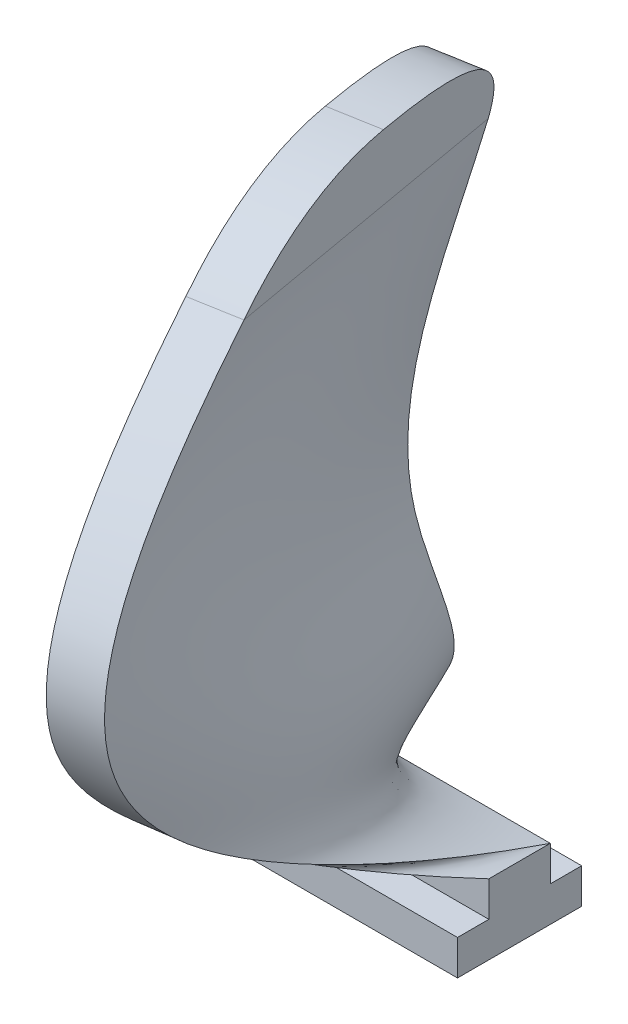
ISO-10303-21;
HEADER;
FILE_DESCRIPTION(('STEP AP214'),'2;1');
FILE_NAME('part.step','',(''),(''),'','','');
FILE_SCHEMA(('AUTOMOTIVE_DESIGN { 1 0 10303 214 1 1 1 1 }'));
ENDSEC;
DATA;
#1=APPLICATION_CONTEXT('core data for automotive mechanical design processes');
#2=APPLICATION_PROTOCOL_DEFINITION('international standard','automotive_design',2000,#1);
#3=PRODUCT_CONTEXT('',#1,'mechanical');
#4=PRODUCT('Part','Part','',(#3));
#5=PRODUCT_RELATED_PRODUCT_CATEGORY('part','',(#4));
#6=PRODUCT_DEFINITION_FORMATION('','',#4);
#7=PRODUCT_DEFINITION_CONTEXT('part definition',#1,'design');
#8=PRODUCT_DEFINITION('design','',#6,#7);
#9=PRODUCT_DEFINITION_SHAPE('','',#8);
#10=(LENGTH_UNIT() NAMED_UNIT(*) SI_UNIT(.MILLI.,.METRE.));
#11=(NAMED_UNIT(*) PLANE_ANGLE_UNIT() SI_UNIT($,.RADIAN.));
#12=(NAMED_UNIT(*) SI_UNIT($,.STERADIAN.) SOLID_ANGLE_UNIT());
#13=UNCERTAINTY_MEASURE_WITH_UNIT(LENGTH_MEASURE(1.E-05),#10,'distance_accuracy_value','');
#14=(GEOMETRIC_REPRESENTATION_CONTEXT(3) GLOBAL_UNCERTAINTY_ASSIGNED_CONTEXT((#13)) GLOBAL_UNIT_ASSIGNED_CONTEXT((#10,
#11,#12)) REPRESENTATION_CONTEXT('',''));
#15=CARTESIAN_POINT('',(0.,0.,0.));
#16=DIRECTION('',(0.,0.,1.));
#17=DIRECTION('',(1.,0.,0.));
#18=AXIS2_PLACEMENT_3D('',#15,#16,#17);
#19=CARTESIAN_POINT('',(10.,2.79856411953538,2.45));
#20=DIRECTION('',(0.,0.,-1.));
#21=DIRECTION('',(0.,1.,0.));
#22=AXIS2_PLACEMENT_3D('',#19,#20,#21);
#23=PLANE('',#22);
#24=DIRECTION('',(0.,-1.,0.));
#25=VECTOR('',#24,1.);
#26=CARTESIAN_POINT('',(-10.,2.79856411953538,2.45));
#27=LINE('',#26,#25);
#28=CARTESIAN_POINT('',(-10.,2.79856411953538,2.45));
#29=VERTEX_POINT('',#28);
#30=CARTESIAN_POINT('',(-10.,0.,2.45));
#31=VERTEX_POINT('',#30);
#32=EDGE_CURVE('E87',#29,#31,#27,.T.);
#33=ORIENTED_EDGE('',*,*,#32,.T.);
#34=DIRECTION('',(-1.,0.,0.));
#35=VECTOR('',#34,1.);
#36=CARTESIAN_POINT('',(10.,0.,2.45));
#37=LINE('',#36,#35);
#38=CARTESIAN_POINT('',(10.,0.,2.45));
#39=VERTEX_POINT('',#38);
#40=EDGE_CURVE('E12',#39,#31,#37,.T.);
#41=ORIENTED_EDGE('',*,*,#40,.F.);
#42=DIRECTION('',(0.,-1.,0.));
#43=VECTOR('',#42,1.);
#44=CARTESIAN_POINT('',(10.,2.79856411953538,2.45));
#45=LINE('',#44,#43);
#46=CARTESIAN_POINT('',(10.,2.79856411953538,2.45));
#47=VERTEX_POINT('',#46);
#48=EDGE_CURVE('E100',#47,#39,#45,.T.);
#49=ORIENTED_EDGE('',*,*,#48,.F.);
#50=DIRECTION('',(1.,0.,0.));
#51=VECTOR('',#50,1.);
#52=CARTESIAN_POINT('',(10.,2.79856411953538,2.45));
#53=LINE('',#52,#51);
#54=EDGE_CURVE('E74',#47,#29,#53,.F.);
#55=ORIENTED_EDGE('',*,*,#54,.T.);
#56=EDGE_LOOP('',(#33,#41,#49,#55));
#57=FACE_BOUND('',#56,.T.);
#58=ADVANCED_FACE('F42',(#57),#23,.F.);
#59=CARTESIAN_POINT('',(10.,2.79856411953538,-2.45));
#60=DIRECTION('',(0.,0.,1.));
#61=DIRECTION('',(0.,-1.,0.));
#62=AXIS2_PLACEMENT_3D('',#59,#60,#61);
#63=PLANE('',#62);
#64=DIRECTION('',(0.,1.,0.));
#65=VECTOR('',#64,1.);
#66=CARTESIAN_POINT('',(-10.,2.79856411953538,-2.45));
#67=LINE('',#66,#65);
#68=CARTESIAN_POINT('',(-10.,0.,-2.45));
#69=VERTEX_POINT('',#68);
#70=CARTESIAN_POINT('',(-10.,2.79856411953538,-2.45));
#71=VERTEX_POINT('',#70);
#72=EDGE_CURVE('E145',#69,#71,#67,.T.);
#73=ORIENTED_EDGE('',*,*,#72,.T.);
#74=DIRECTION('',(1.,0.,0.));
#75=VECTOR('',#74,1.);
#76=CARTESIAN_POINT('',(10.,2.79856411953538,-2.45));
#77=LINE('',#76,#75);
#78=CARTESIAN_POINT('',(10.,2.79856411953538,-2.45));
#79=VERTEX_POINT('',#78);
#80=EDGE_CURVE('E98',#79,#71,#77,.F.);
#81=ORIENTED_EDGE('',*,*,#80,.F.);
#82=DIRECTION('',(0.,1.,0.));
#83=VECTOR('',#82,1.);
#84=CARTESIAN_POINT('',(10.,2.79856411953538,-2.45));
#85=LINE('',#84,#83);
#86=CARTESIAN_POINT('',(10.,0.,-2.45));
#87=VERTEX_POINT('',#86);
#88=EDGE_CURVE('E95',#87,#79,#85,.T.);
#89=ORIENTED_EDGE('',*,*,#88,.F.);
#90=DIRECTION('',(-1.,0.,0.));
#91=VECTOR('',#90,1.);
#92=CARTESIAN_POINT('',(10.,0.,-2.45));
#93=LINE('',#92,#91);
#94=EDGE_CURVE('E52',#87,#69,#93,.T.);
#95=ORIENTED_EDGE('',*,*,#94,.T.);
#96=EDGE_LOOP('',(#73,#81,#89,#95));
#97=FACE_BOUND('',#96,.T.);
#98=ADVANCED_FACE('F96',(#97),#63,.F.);
#99=CARTESIAN_POINT('',(10.,0.,0.));
#100=DIRECTION('',(1.,0.,0.));
#101=DIRECTION('',(0.,0.,-1.));
#102=AXIS2_PLACEMENT_3D('',#99,#100,#101);
#103=PLANE('',#102);
#104=ORIENTED_EDGE('',*,*,#48,.T.);
#105=DIRECTION('',(0.,0.,1.));
#106=VECTOR('',#105,1.);
#107=CARTESIAN_POINT('',(10.,0.,4.95));
#108=LINE('',#107,#106);
#109=CARTESIAN_POINT('',(10.,0.,4.95));
#110=VERTEX_POINT('',#109);
#111=EDGE_CURVE('E118',#39,#110,#108,.T.);
#112=ORIENTED_EDGE('',*,*,#111,.T.);
#113=DIRECTION('',(0.,-1.,0.));
#114=VECTOR('',#113,1.);
#115=CARTESIAN_POINT('',(10.,0.,4.95));
#116=LINE('',#115,#114);
#117=CARTESIAN_POINT('',(10.,-2.8,4.95));
#118=VERTEX_POINT('',#117);
#119=EDGE_CURVE('E136',#110,#118,#116,.T.);
#120=ORIENTED_EDGE('',*,*,#119,.T.);
#121=DIRECTION('',(0.,0.,-1.));
#122=VECTOR('',#121,1.);
#123=CARTESIAN_POINT('',(10.,-2.8,4.95));
#124=LINE('',#123,#122);
#125=CARTESIAN_POINT('',(10.,-2.8,-4.95));
#126=VERTEX_POINT('',#125);
#127=EDGE_CURVE('E441',#118,#126,#124,.T.);
#128=ORIENTED_EDGE('',*,*,#127,.T.);
#129=DIRECTION('',(0.,1.,0.));
#130=VECTOR('',#129,1.);
#131=CARTESIAN_POINT('',(10.,0.,-4.95));
#132=LINE('',#131,#130);
#133=CARTESIAN_POINT('',(10.,0.,-4.95));
#134=VERTEX_POINT('',#133);
#135=EDGE_CURVE('E115',#126,#134,#132,.T.);
#136=ORIENTED_EDGE('',*,*,#135,.T.);
#137=EDGE_CURVE('E107',#134,#87,#108,.T.);
#138=ORIENTED_EDGE('',*,*,#137,.T.);
#139=ORIENTED_EDGE('',*,*,#88,.T.);
#140=DIRECTION('',(0.,0.,-1.));
#141=VECTOR('',#140,1.);
#142=CARTESIAN_POINT('',(10.,2.79856411953538,0.));
#143=LINE('',#142,#141);
#144=EDGE_CURVE('E61',#79,#47,#143,.F.);
#145=ORIENTED_EDGE('',*,*,#144,.T.);
#146=EDGE_LOOP('',(#104,#112,#120,#128,#136,#138,#139,#145));
#147=FACE_BOUND('',#146,.T.);
#148=ADVANCED_FACE('F112',(#147),#103,.T.);
#149=CARTESIAN_POINT('',(-10.,0.,0.));
#150=DIRECTION('',(1.,0.,0.));
#151=DIRECTION('',(0.,0.,-1.));
#152=AXIS2_PLACEMENT_3D('',#149,#150,#151);
#153=PLANE('',#152);
#154=ORIENTED_EDGE('',*,*,#32,.F.);
#155=DIRECTION('',(0.,0.,-1.));
#156=VECTOR('',#155,1.);
#157=CARTESIAN_POINT('',(-10.,2.79856411953538,0.));
#158=LINE('',#157,#156);
#159=EDGE_CURVE('E146',#71,#29,#158,.F.);
#160=ORIENTED_EDGE('',*,*,#159,.F.);
#161=ORIENTED_EDGE('',*,*,#72,.F.);
#162=DIRECTION('',(0.,0.,1.));
#163=VECTOR('',#162,1.);
#164=CARTESIAN_POINT('',(-10.,0.,4.95));
#165=LINE('',#164,#163);
#166=CARTESIAN_POINT('',(-10.,0.,-4.95));
#167=VERTEX_POINT('',#166);
#168=EDGE_CURVE('E109',#167,#69,#165,.T.);
#169=ORIENTED_EDGE('',*,*,#168,.F.);
#170=DIRECTION('',(0.,1.,0.));
#171=VECTOR('',#170,1.);
#172=CARTESIAN_POINT('',(-10.,0.,-4.95));
#173=LINE('',#172,#171);
#174=CARTESIAN_POINT('',(-10.,-2.8,-4.95));
#175=VERTEX_POINT('',#174);
#176=EDGE_CURVE('E132',#175,#167,#173,.T.);
#177=ORIENTED_EDGE('',*,*,#176,.F.);
#178=DIRECTION('',(0.,0.,-1.));
#179=VECTOR('',#178,1.);
#180=CARTESIAN_POINT('',(-10.,-2.8,4.95));
#181=LINE('',#180,#179);
#182=CARTESIAN_POINT('',(-10.,-2.8,4.95));
#183=VERTEX_POINT('',#182);
#184=EDGE_CURVE('E129',#183,#175,#181,.T.);
#185=ORIENTED_EDGE('',*,*,#184,.F.);
#186=DIRECTION('',(0.,-1.,0.));
#187=VECTOR('',#186,1.);
#188=CARTESIAN_POINT('',(-10.,0.,4.95));
#189=LINE('',#188,#187);
#190=CARTESIAN_POINT('',(-10.,0.,4.95));
#191=VERTEX_POINT('',#190);
#192=EDGE_CURVE('E126',#191,#183,#189,.T.);
#193=ORIENTED_EDGE('',*,*,#192,.F.);
#194=EDGE_CURVE('E135',#31,#191,#165,.T.);
#195=ORIENTED_EDGE('',*,*,#194,.F.);
#196=EDGE_LOOP('',(#154,#160,#161,#169,#177,#185,#193,#195));
#197=FACE_BOUND('',#196,.T.);
#198=ADVANCED_FACE('F398',(#197),#153,.F.);
#199=CARTESIAN_POINT('',(10.,0.,4.95));
#200=DIRECTION('',(0.,-1.,0.));
#201=DIRECTION('',(0.,0.,-1.));
#202=AXIS2_PLACEMENT_3D('',#199,#200,#201);
#203=PLANE('',#202);
#204=ORIENTED_EDGE('',*,*,#111,.F.);
#205=ORIENTED_EDGE('',*,*,#40,.T.);
#206=ORIENTED_EDGE('',*,*,#194,.T.);
#207=DIRECTION('',(-1.,0.,0.));
#208=VECTOR('',#207,1.);
#209=CARTESIAN_POINT('',(10.,0.,4.95));
#210=LINE('',#209,#208);
#211=EDGE_CURVE('E117',#110,#191,#210,.T.);
#212=ORIENTED_EDGE('',*,*,#211,.F.);
#213=EDGE_LOOP('',(#204,#205,#206,#212));
#214=FACE_BOUND('',#213,.T.);
#215=ADVANCED_FACE('F390',(#214),#203,.F.);
#216=CARTESIAN_POINT('',(10.,0.,4.95));
#217=DIRECTION('',(0.,0.,-1.));
#218=DIRECTION('',(0.,1.,0.));
#219=AXIS2_PLACEMENT_3D('',#216,#217,#218);
#220=PLANE('',#219);
#221=ORIENTED_EDGE('',*,*,#192,.T.);
#222=DIRECTION('',(-1.,0.,0.));
#223=VECTOR('',#222,1.);
#224=CARTESIAN_POINT('',(10.,-2.8,4.95));
#225=LINE('',#224,#223);
#226=EDGE_CURVE('E142',#118,#183,#225,.T.);
#227=ORIENTED_EDGE('',*,*,#226,.F.);
#228=ORIENTED_EDGE('',*,*,#119,.F.);
#229=ORIENTED_EDGE('',*,*,#211,.T.);
#230=EDGE_LOOP('',(#221,#227,#228,#229));
#231=FACE_BOUND('',#230,.T.);
#232=ADVANCED_FACE('F404',(#231),#220,.F.);
#233=CARTESIAN_POINT('',(10.,-2.8,4.95));
#234=DIRECTION('',(0.,1.,0.));
#235=DIRECTION('',(0.,0.,1.));
#236=AXIS2_PLACEMENT_3D('',#233,#234,#235);
#237=PLANE('',#236);
#238=ORIENTED_EDGE('',*,*,#184,.T.);
#239=DIRECTION('',(-1.,0.,0.));
#240=VECTOR('',#239,1.);
#241=CARTESIAN_POINT('',(10.,-2.8,-4.95));
#242=LINE('',#241,#240);
#243=EDGE_CURVE('E139',#126,#175,#242,.T.);
#244=ORIENTED_EDGE('',*,*,#243,.F.);
#245=ORIENTED_EDGE('',*,*,#127,.F.);
#246=ORIENTED_EDGE('',*,*,#226,.T.);
#247=EDGE_LOOP('',(#238,#244,#245,#246));
#248=FACE_BOUND('',#247,.T.);
#249=ADVANCED_FACE('F407',(#248),#237,.F.);
#250=CARTESIAN_POINT('',(10.,0.,-4.95));
#251=DIRECTION('',(0.,0.,1.));
#252=DIRECTION('',(0.,-1.,0.));
#253=AXIS2_PLACEMENT_3D('',#250,#251,#252);
#254=PLANE('',#253);
#255=ORIENTED_EDGE('',*,*,#176,.T.);
#256=DIRECTION('',(-1.,0.,0.));
#257=VECTOR('',#256,1.);
#258=CARTESIAN_POINT('',(10.,0.,-4.95));
#259=LINE('',#258,#257);
#260=EDGE_CURVE('E121',#134,#167,#259,.T.);
#261=ORIENTED_EDGE('',*,*,#260,.F.);
#262=ORIENTED_EDGE('',*,*,#135,.F.);
#263=ORIENTED_EDGE('',*,*,#243,.T.);
#264=EDGE_LOOP('',(#255,#261,#262,#263));
#265=FACE_BOUND('',#264,.T.);
#266=ADVANCED_FACE('F389',(#265),#254,.F.);
#267=ORIENTED_EDGE('',*,*,#94,.F.);
#268=ORIENTED_EDGE('',*,*,#137,.F.);
#269=ORIENTED_EDGE('',*,*,#260,.T.);
#270=ORIENTED_EDGE('',*,*,#168,.T.);
#271=EDGE_LOOP('',(#267,#268,#269,#270));
#272=FACE_BOUND('',#271,.T.);
#273=ADVANCED_FACE('F105',(#272),#203,.F.);
#274=CARTESIAN_POINT('',(10.,2.79856411953538,-2.45));
#275=CARTESIAN_POINT('',(7.82884164371637,4.1239699270205,5.6409345672917));
#276=CARTESIAN_POINT('',(4.12056500510088,8.5382028021638,19.6349362777301));
#277=CARTESIAN_POINT('',(5.3267315928629,25.0708030082672,32.8361289712791));
#278=CARTESIAN_POINT('',(2.85578021425108,36.0695664016418,21.3217599922398));
#279=CARTESIAN_POINT('',(1.65339363802755,42.7985641195354,13.6253711741352));
#280=CARTESIAN_POINT('',(3.33333333333333,2.79856411953538,-2.45));
#281=CARTESIAN_POINT('',(3.66063205225053,4.27186432247661,2.58406787890734));
#282=CARTESIAN_POINT('',(6.09020856843552,8.48473014482571,10.9147153158842));
#283=CARTESIAN_POINT('',(4.67174872730662,25.1231451251588,21.6750831217643));
#284=CARTESIAN_POINT('',(1.24851992146101,35.9397411120689,12.1547094155761));
#285=CARTESIAN_POINT('',(0.264208216692133,42.7985641195354,5.74690915003758));
#286=CARTESIAN_POINT('',(-3.33333333333333,2.79856411953538,-2.45));
#287=CARTESIAN_POINT('',(-0.507577539215303,4.41975871793272,-0.472798809477015));
#288=CARTESIAN_POINT('',(5.75454963744296,8.43125748748763,2.6009813824828));
#289=CARTESIAN_POINT('',(2.12553540366518,25.1754872420504,10.8475122287474));
#290=CARTESIAN_POINT('',(-0.358740371329061,35.809915822496,2.98765883891247));
#291=CARTESIAN_POINT('',(-1.12497720464329,42.7985641195354,-2.13155287406009));
#292=CARTESIAN_POINT('',(-10.,2.79856411953538,-2.45));
#293=CARTESIAN_POINT('',(-4.67578713068114,4.56765311338883,-3.52966549786137));
#294=CARTESIAN_POINT('',(3.1135882121232,8.37778483014954,-5.30626552247422));
#295=CARTESIAN_POINT('',(-2.31190837806142,25.227829358942,0.353416292228674));
#296=CARTESIAN_POINT('',(-1.96600066411913,35.6800905329232,-6.17939173775118));
#297=CARTESIAN_POINT('',(-2.51416262597871,42.7985641195354,-10.0100148981578));
#298=B_SPLINE_SURFACE_WITH_KNOTS('',3,3,((#274,#275,#276,#277,#278,#279),(#280,#281,#282,#283,
#284,#285),(#286,#287,#288,#289,#290,#291),(#292,#293,#294,#295,#296,#297)),.UNSPECIFIED.,.F.,
.F.,.F.,(4,4),(4,1,1,4),(0.,1.),(0.,0.309735351144895,0.526897771326308,1.),.UNSPECIFIED.);
#299=CARTESIAN_POINT('',(-10.,2.79856411953538,-2.45));
#300=CARTESIAN_POINT('',(-4.67578713068114,4.56765311338883,-3.52966549786137));
#301=CARTESIAN_POINT('',(3.1135882121232,8.37778483014954,-5.30626552247422));
#302=CARTESIAN_POINT('',(-2.31190837806142,25.227829358942,0.353416292228674));
#303=CARTESIAN_POINT('',(-1.96600066411913,35.6800905329232,-6.17939173775118));
#304=CARTESIAN_POINT('',(-2.51416262597871,42.7985641195354,-10.0100148981578));
#305=B_SPLINE_CURVE_WITH_KNOTS('',3,(#299,#300,#301,#302,#303,#304),.UNSPECIFIED.,.F.,.F.,(4,1,
1,4),(0.,0.309735351144895,0.526897771326308,1.),.UNSPECIFIED.);
#306=CARTESIAN_POINT('',(-2.51416262597871,42.7985641195354,-10.0100148981578));
#307=VERTEX_POINT('',#306);
#308=EDGE_CURVE('E267',#71,#307,#305,.T.);
#309=DIRECTION('',(-0.173648177666928,0.,-0.984807753012209));
#310=VECTOR('',#309,1.);
#311=CARTESIAN_POINT('',(-2.51416262597871,42.7985641195354,-10.0100148981578));
#312=LINE('',#311,#310);
#313=CARTESIAN_POINT('',(1.65339363802755,42.7985641195354,13.6253711741352));
#314=VERTEX_POINT('',#313);
#315=EDGE_CURVE('E215',#314,#307,#312,.T.);
#316=CARTESIAN_POINT('',(10.,2.79856411953538,-2.45));
#317=CARTESIAN_POINT('',(7.82884164371637,4.1239699270205,5.6409345672917));
#318=CARTESIAN_POINT('',(4.12056500510088,8.5382028021638,19.6349362777301));
#319=CARTESIAN_POINT('',(5.3267315928629,25.0708030082672,32.8361289712791));
#320=CARTESIAN_POINT('',(2.85578021425108,36.0695664016418,21.3217599922398));
#321=CARTESIAN_POINT('',(1.65339363802755,42.7985641195354,13.6253711741352));
#322=B_SPLINE_CURVE_WITH_KNOTS('',3,(#316,#317,#318,#319,#320,#321),.UNSPECIFIED.,.F.,.F.,(4,1,
1,4),(0.,0.309735351144895,0.526897771326308,1.),.UNSPECIFIED.);
#323=EDGE_CURVE('E266',#314,#79,#322,.F.);
#324=ORIENTED_EDGE('',*,*,#80,.T.);
#325=ORIENTED_EDGE('',*,*,#308,.T.);
#326=ORIENTED_EDGE('',*,*,#315,.F.);
#327=ORIENTED_EDGE('',*,*,#323,.T.);
#328=EDGE_LOOP('',(#324,#325,#326,#327));
#329=FACE_BOUND('',#328,.T.);
#330=ADVANCED_FACE('F370',(#329),#298,.T.);
#331=CARTESIAN_POINT('',(-10.,2.79856411953538,-2.45));
#332=CARTESIAN_POINT('',(-4.67578713068114,4.56765311338883,-3.52966549786137));
#333=CARTESIAN_POINT('',(3.1135882121232,8.37778483014954,-5.30626552247422));
#334=CARTESIAN_POINT('',(-2.31190837806142,25.227829358942,0.353416292228672));
#335=CARTESIAN_POINT('',(-1.96600066411913,35.6800905329232,-6.17939173775118));
#336=CARTESIAN_POINT('',(-2.51416262597871,42.7985641195354,-10.0100148981578));
#337=CARTESIAN_POINT('',(-10.,2.79856411953538,-0.816666666666666));
#338=CARTESIAN_POINT('',(-5.26554212451829,4.65086780414337,-2.57124619651446));
#339=CARTESIAN_POINT('',(1.57534445610194,8.35188048689354,-5.30101157067341));
#340=CARTESIAN_POINT('',(-3.49839449947881,25.2423930262984,0.712162243207889));
#341=CARTESIAN_POINT('',(-3.27907766813541,35.6800905329232,-5.94786083419527));
#342=CARTESIAN_POINT('',(-3.82723962999499,42.7985641195354,-9.77848399460185));
#343=CARTESIAN_POINT('',(-10.,2.79856411953538,0.816666666666667));
#344=CARTESIAN_POINT('',(-5.85529711835543,4.73408249489792,-1.61282689516755));
#345=CARTESIAN_POINT('',(0.0371007000806762,8.32597614363755,-5.29575761887261));
#346=CARTESIAN_POINT('',(-4.68488062089619,25.2569566936548,1.07090819418711));
#347=CARTESIAN_POINT('',(-4.59215467215169,35.6800905329232,-5.71632993063936));
#348=CARTESIAN_POINT('',(-5.14031663401126,42.7985641195354,-9.54695309104595));
#349=CARTESIAN_POINT('',(-10.,2.79856411953538,2.45));
#350=CARTESIAN_POINT('',(-6.44505211219258,4.81729718565246,-0.654407593820641));
#351=CARTESIAN_POINT('',(-1.50114305594059,8.30007180038154,-5.2905036670718));
#352=CARTESIAN_POINT('',(-5.87136674231358,25.2715203610112,1.42965414516632));
#353=CARTESIAN_POINT('',(-5.90523167616796,35.6800905329232,-5.48479902708345));
#354=CARTESIAN_POINT('',(-6.45339363802754,42.7985641195354,-9.31542218749005));
#355=B_SPLINE_SURFACE_WITH_KNOTS('',3,3,((#331,#332,#333,#334,#335,#336),(#337,#338,#339,#340,
#341,#342),(#343,#344,#345,#346,#347,#348),(#349,#350,#351,#352,#353,#354)),.UNSPECIFIED.,.F.,
.F.,.F.,(4,4),(4,1,1,4),(0.,1.),(0.,0.309735351144895,0.526897771326308,1.),.UNSPECIFIED.);
#356=CARTESIAN_POINT('',(-10.,2.79856411953538,2.45));
#357=CARTESIAN_POINT('',(-6.44505211219258,4.81729718565246,-0.654407593820641));
#358=CARTESIAN_POINT('',(-1.50114305594059,8.30007180038154,-5.2905036670718));
#359=CARTESIAN_POINT('',(-5.87136674231358,25.2715203610112,1.42965414516632));
#360=CARTESIAN_POINT('',(-5.90523167616796,35.6800905329232,-5.48479902708345));
#361=CARTESIAN_POINT('',(-6.45339363802754,42.7985641195354,-9.31542218749005));
#362=B_SPLINE_CURVE_WITH_KNOTS('',3,(#356,#357,#358,#359,#360,#361),.UNSPECIFIED.,.F.,.F.,(4,1,
1,4),(0.,0.309735351144895,0.526897771326308,1.),.UNSPECIFIED.);
#363=CARTESIAN_POINT('',(-6.45339363802754,42.7985641195354,-9.31542218749005));
#364=VERTEX_POINT('',#363);
#365=EDGE_CURVE('E268',#29,#364,#362,.T.);
#366=DIRECTION('',(-0.984807753012209,0.,0.173648177666927));
#367=VECTOR('',#366,1.);
#368=CARTESIAN_POINT('',(-6.45339363802754,42.7985641195354,-9.31542218749005));
#369=LINE('',#368,#367);
#370=EDGE_CURVE('E219',#307,#364,#369,.T.);
#371=ORIENTED_EDGE('',*,*,#159,.T.);
#372=ORIENTED_EDGE('',*,*,#365,.T.);
#373=ORIENTED_EDGE('',*,*,#370,.F.);
#374=ORIENTED_EDGE('',*,*,#308,.F.);
#375=EDGE_LOOP('',(#371,#372,#373,#374));
#376=FACE_BOUND('',#375,.T.);
#377=ADVANCED_FACE('F324',(#376),#355,.T.);
#378=CARTESIAN_POINT('',(10.,2.79856411953538,2.45));
#379=CARTESIAN_POINT('',(6.00193501471665,4.2755348158669,8.88978455179783));
#380=CARTESIAN_POINT('',(-0.476222688230629,8.49102136255699,19.5344006692791));
#381=CARTESIAN_POINT('',(1.75718518078791,25.0973288609028,33.9777503609162));
#382=CARTESIAN_POINT('',(-1.08345079779775,36.0695664016418,22.0163527029075));
#383=CARTESIAN_POINT('',(-2.28583737402128,42.7985641195354,14.319963884803));
#384=CARTESIAN_POINT('',(10.,2.79856411953538,0.816666666666667));
#385=CARTESIAN_POINT('',(6.61090389104989,4.22501318625144,7.80683455696246));
#386=CARTESIAN_POINT('',(1.05603987621321,8.5067485090926,19.5679125387628));
#387=CARTESIAN_POINT('',(2.94703398481291,25.0884869100242,33.5972098977038));
#388=CARTESIAN_POINT('',(0.229626206218523,36.0695664016418,21.7848217993516));
#389=CARTESIAN_POINT('',(-0.972760370005002,42.7985641195354,14.0884329812471));
#390=CARTESIAN_POINT('',(10.,2.79856411953538,-0.816666666666666));
#391=CARTESIAN_POINT('',(7.21987276738313,4.17449155663597,6.72388456212708));
#392=CARTESIAN_POINT('',(2.58830244065704,8.5224756556282,19.6014244082464));
#393=CARTESIAN_POINT('',(4.13688278883791,25.0796449591457,33.2166694344915));
#394=CARTESIAN_POINT('',(1.5427032102348,36.0695664016418,21.5532908957957));
#395=CARTESIAN_POINT('',(0.340316634011276,42.7985641195354,13.8569020776911));
#396=CARTESIAN_POINT('',(10.,2.79856411953538,-2.45));
#397=CARTESIAN_POINT('',(7.82884164371637,4.1239699270205,5.6409345672917));
#398=CARTESIAN_POINT('',(4.12056500510088,8.5382028021638,19.6349362777301));
#399=CARTESIAN_POINT('',(5.3267315928629,25.0708030082672,32.8361289712791));
#400=CARTESIAN_POINT('',(2.85578021425108,36.0695664016418,21.3217599922398));
#401=CARTESIAN_POINT('',(1.65339363802755,42.7985641195354,13.6253711741352));
#402=B_SPLINE_SURFACE_WITH_KNOTS('',3,3,((#378,#379,#380,#381,#382,#383),(#384,#385,#386,#387,
#388,#389),(#390,#391,#392,#393,#394,#395),(#396,#397,#398,#399,#400,#401)),.UNSPECIFIED.,.F.,
.F.,.F.,(4,4),(4,1,1,4),(0.,1.),(0.,0.309735351144895,0.526897771326308,1.),.UNSPECIFIED.);
#403=DIRECTION('',(0.984807753012208,0.,-0.173648177666928));
#404=VECTOR('',#403,1.);
#405=CARTESIAN_POINT('',(1.65339363802755,42.7985641195354,13.6253711741352));
#406=LINE('',#405,#404);
#407=CARTESIAN_POINT('',(-2.28583737402128,42.7985641195354,14.319963884803));
#408=VERTEX_POINT('',#407);
#409=EDGE_CURVE('E45',#408,#314,#406,.T.);
#410=CARTESIAN_POINT('',(10.,2.79856411953538,2.45));
#411=CARTESIAN_POINT('',(6.00193501471665,4.2755348158669,8.88978455179783));
#412=CARTESIAN_POINT('',(-0.47622268823063,8.49102136255699,19.5344006692791));
#413=CARTESIAN_POINT('',(1.75718518078791,25.0973288609028,33.9777503609162));
#414=CARTESIAN_POINT('',(-1.08345079779775,36.0695664016418,22.0163527029075));
#415=CARTESIAN_POINT('',(-2.28583737402128,42.7985641195354,14.319963884803));
#416=B_SPLINE_CURVE_WITH_KNOTS('',3,(#410,#411,#412,#413,#414,#415),.UNSPECIFIED.,.F.,.F.,(4,1,
1,4),(0.,0.309735351144895,0.526897771326308,1.),.UNSPECIFIED.);
#417=EDGE_CURVE('E287',#47,#408,#416,.T.);
#418=ORIENTED_EDGE('',*,*,#144,.F.);
#419=ORIENTED_EDGE('',*,*,#323,.F.);
#420=ORIENTED_EDGE('',*,*,#409,.F.);
#421=ORIENTED_EDGE('',*,*,#417,.F.);
#422=EDGE_LOOP('',(#418,#419,#420,#421));
#423=FACE_BOUND('',#422,.T.);
#424=ADVANCED_FACE('F311',(#423),#402,.T.);
#425=CARTESIAN_POINT('',(-10.,2.79856411953538,2.45));
#426=CARTESIAN_POINT('',(-6.44505211219258,4.81729718565246,-0.654407593820641));
#427=CARTESIAN_POINT('',(-1.50114305594059,8.30007180038154,-5.2905036670718));
#428=CARTESIAN_POINT('',(-5.87136674231357,25.2715203610112,1.42965414516632));
#429=CARTESIAN_POINT('',(-5.90523167616796,35.6800905329232,-5.48479902708345));
#430=CARTESIAN_POINT('',(-6.45339363802754,42.7985641195354,-9.31542218749004));
#431=CARTESIAN_POINT('',(-3.33333333333333,2.79856411953538,2.45));
#432=CARTESIAN_POINT('',(-2.29605640322283,4.63670972905727,2.52698978805218));
#433=CARTESIAN_POINT('',(0.15781277767351,8.36372165444003,2.75218614307693));
#434=CARTESIAN_POINT('',(-2.24781298237394,25.2134565276417,12.0884624324174));
#435=CARTESIAN_POINT('',(-4.29797138337789,35.809915822496,3.68225154958019));
#436=CARTESIAN_POINT('',(-5.06420821669212,42.7985641195354,-1.43696016339237));
#437=CARTESIAN_POINT('',(3.33333333333333,2.79856411953538,2.45));
#438=CARTESIAN_POINT('',(1.85293930574691,4.45612227246209,5.70838716992501));
#439=CARTESIAN_POINT('',(0.499452900243496,8.4273715084985,11.0271542551939));
#440=CARTESIAN_POINT('',(0.295037658659886,25.1553926942723,22.9378278376674));
#441=CARTESIAN_POINT('',(-2.69071109058782,35.9397411120689,12.8493021262438));
#442=CARTESIAN_POINT('',(-3.6750227953567,42.7985641195354,6.44150186070529));
#443=CARTESIAN_POINT('',(10.,2.79856411953538,2.45));
#444=CARTESIAN_POINT('',(6.00193501471665,4.2755348158669,8.88978455179783));
#445=CARTESIAN_POINT('',(-0.47622268823063,8.49102136255699,19.5344006692791));
#446=CARTESIAN_POINT('',(1.75718518078791,25.0973288609028,33.9777503609162));
#447=CARTESIAN_POINT('',(-1.08345079779775,36.0695664016418,22.0163527029075));
#448=CARTESIAN_POINT('',(-2.28583737402128,42.7985641195354,14.319963884803));
#449=B_SPLINE_SURFACE_WITH_KNOTS('',3,3,((#425,#426,#427,#428,#429,#430),(#431,#432,#433,#434,
#435,#436),(#437,#438,#439,#440,#441,#442),(#443,#444,#445,#446,#447,#448)),.UNSPECIFIED.,.F.,
.F.,.F.,(4,4),(4,1,1,4),(0.,1.),(0.,0.309735351144895,0.526897771326308,1.),.UNSPECIFIED.);
#450=DIRECTION('',(0.173648177666928,0.,0.984807753012208));
#451=VECTOR('',#450,1.);
#452=CARTESIAN_POINT('',(-2.28583737402128,42.7985641195354,14.319963884803));
#453=LINE('',#452,#451);
#454=EDGE_CURVE('E233',#364,#408,#453,.T.);
#455=ORIENTED_EDGE('',*,*,#54,.F.);
#456=ORIENTED_EDGE('',*,*,#417,.T.);
#457=ORIENTED_EDGE('',*,*,#454,.F.);
#458=ORIENTED_EDGE('',*,*,#365,.F.);
#459=EDGE_LOOP('',(#455,#456,#457,#458));
#460=FACE_BOUND('',#459,.T.);
#461=ADVANCED_FACE('F323',(#460),#449,.T.);
#462=CARTESIAN_POINT('',(-4.66576899350218,48.,0.822700959307404));
#463=CARTESIAN_POINT('',(-6.35059599217042,48.,-8.732427767441));
#464=CARTESIAN_POINT('',(-6.77211817035313,46.176791960537,-11.1229988331343));
#465=CARTESIAN_POINT('',(-6.45339363802755,42.7985641195354,-9.31542218749005));
#466=B_SPLINE_CURVE_WITH_KNOTS('',3,(#462,#463,#464,#465),.UNSPECIFIED.,.F.,.F.,(4,4),(0.,1.),.UNSPECIFIED.);
#467=DIRECTION('',(0.984807753012209,0.,-0.173648177666928));
#468=VECTOR('',#467,1.);
#469=SURFACE_OF_LINEAR_EXTRUSION('',#466,#468);
#470=CARTESIAN_POINT('',(-0.726537981453343,48.,0.128108248639693));
#471=CARTESIAN_POINT('',(-2.41136498012158,48.,-9.42702047810871));
#472=CARTESIAN_POINT('',(-2.83288715830429,46.176791960537,-11.817591543802));
#473=CARTESIAN_POINT('',(-2.51416262597871,42.7985641195354,-10.0100148981578));
#474=B_SPLINE_CURVE_WITH_KNOTS('',3,(#470,#471,#472,#473),.UNSPECIFIED.,.F.,.F.,(4,4),(0.,1.),.UNSPECIFIED.);
#475=CARTESIAN_POINT('',(-0.726537981453344,48.,0.128108248639689));
#476=VERTEX_POINT('',#475);
#477=EDGE_CURVE('E214',#476,#307,#474,.T.);
#478=ORIENTED_EDGE('',*,*,#477,.T.);
#479=ORIENTED_EDGE('',*,*,#370,.T.);
#480=CARTESIAN_POINT('',(-4.66576899350218,48.,0.822700959307399));
#481=VERTEX_POINT('',#480);
#482=EDGE_CURVE('E160',#481,#364,#466,.T.);
#483=ORIENTED_EDGE('',*,*,#482,.F.);
#484=DIRECTION('',(0.984807753012209,0.,-0.173648177666928));
#485=VECTOR('',#484,1.);
#486=CARTESIAN_POINT('',(-4.66576899350218,48.,0.822700959307399));
#487=LINE('',#486,#485);
#488=EDGE_CURVE('E159',#481,#476,#487,.T.);
#489=ORIENTED_EDGE('',*,*,#488,.T.);
#490=EDGE_LOOP('',(#478,#479,#483,#489));
#491=FACE_BOUND('',#490,.T.);
#492=ADVANCED_FACE('F183',(#491),#469,.F.);
#493=CARTESIAN_POINT('',(-2.28583737402128,42.7985641195354,14.319963884803));
#494=CARTESIAN_POINT('',(-3.00663061142901,46.3848974912323,10.2321423017891));
#495=CARTESIAN_POINT('',(-3.81724867145621,48.,5.63489883530292));
#496=CARTESIAN_POINT('',(-4.66576899350218,48.,0.822700959307399));
#497=B_SPLINE_CURVE_WITH_KNOTS('',3,(#493,#494,#495,#496),.UNSPECIFIED.,.F.,.F.,(4,4),(0.,1.),.UNSPECIFIED.);
#498=DIRECTION('',(0.984807753012209,0.,-0.173648177666928));
#499=VECTOR('',#498,1.);
#500=SURFACE_OF_LINEAR_EXTRUSION('',#497,#499);
#501=CARTESIAN_POINT('',(1.65339363802755,42.7985641195354,13.6253711741352));
#502=CARTESIAN_POINT('',(0.932600400619824,46.3848974912323,9.53754959112134));
#503=CARTESIAN_POINT('',(0.12198234059262,48.,4.9403061246352));
#504=CARTESIAN_POINT('',(-0.726537981453344,48.,0.128108248639689));
#505=B_SPLINE_CURVE_WITH_KNOTS('',3,(#501,#502,#503,#504),.UNSPECIFIED.,.F.,.F.,(4,4),(0.,1.),.UNSPECIFIED.);
#506=EDGE_CURVE('E209',#314,#476,#505,.T.);
#507=ORIENTED_EDGE('',*,*,#506,.T.);
#508=ORIENTED_EDGE('',*,*,#488,.F.);
#509=EDGE_CURVE('E155',#408,#481,#497,.T.);
#510=ORIENTED_EDGE('',*,*,#509,.F.);
#511=ORIENTED_EDGE('',*,*,#409,.T.);
#512=EDGE_LOOP('',(#507,#508,#510,#511));
#513=FACE_BOUND('',#512,.T.);
#514=ADVANCED_FACE('F177',(#513),#500,.F.);
#515=CARTESIAN_POINT('',(-6.31091313988755,46.6661175001433,-8.50737512873858));
#516=DIRECTION('',(-0.984807753012209,0.,0.173648177666927));
#517=DIRECTION('',(0.173648177666927,0.,0.984807753012209));
#518=AXIS2_PLACEMENT_3D('',#515,#516,#517);
#519=PLANE('',#518);
#520=ORIENTED_EDGE('',*,*,#482,.T.);
#521=ORIENTED_EDGE('',*,*,#454,.T.);
#522=ORIENTED_EDGE('',*,*,#509,.T.);
#523=EDGE_LOOP('',(#520,#521,#522));
#524=FACE_BOUND('',#523,.T.);
#525=ADVANCED_FACE('F182',(#524),#519,.T.);
#526=CARTESIAN_POINT('',(-2.37168212783871,46.6661175001433,-9.20196783940629));
#527=DIRECTION('',(-0.984807753012209,0.,0.173648177666927));
#528=DIRECTION('',(0.173648177666927,0.,0.984807753012209));
#529=AXIS2_PLACEMENT_3D('',#526,#527,#528);
#530=PLANE('',#529);
#531=ORIENTED_EDGE('',*,*,#477,.F.);
#532=ORIENTED_EDGE('',*,*,#506,.F.);
#533=ORIENTED_EDGE('',*,*,#315,.T.);
#534=EDGE_LOOP('',(#531,#532,#533));
#535=FACE_BOUND('',#534,.T.);
#536=ADVANCED_FACE('F185',(#535),#530,.F.);
#537=CLOSED_SHELL('',(#58,#98,#148,#198,#215,#232,#249,#266,#273,#330,#377,#424,#461,#492,#514,
#525,#536));
#538=MANIFOLD_SOLID_BREP('B2',#537);
#539=ADVANCED_BREP_SHAPE_REPRESENTATION('',(#18,#538),#14);
#540=SHAPE_DEFINITION_REPRESENTATION(#9,#539);
ENDSEC;
END-ISO-10303-21;
